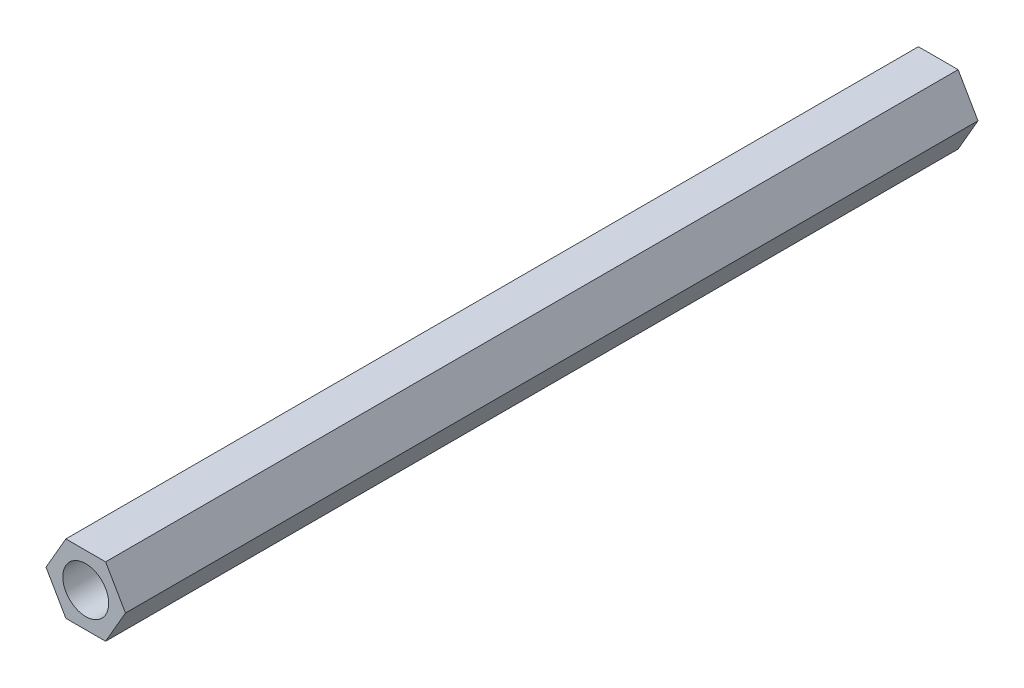
ISO-10303-21;
HEADER;
FILE_DESCRIPTION(('STEP AP214'),'2;1');
FILE_NAME('part.step','',(''),(''),'','','');
FILE_SCHEMA(('AUTOMOTIVE_DESIGN { 1 0 10303 214 1 1 1 1 }'));
ENDSEC;
DATA;
#1=APPLICATION_CONTEXT('core data for automotive mechanical design processes');
#2=APPLICATION_PROTOCOL_DEFINITION('international standard','automotive_design',2000,#1);
#3=PRODUCT_CONTEXT('',#1,'mechanical');
#4=PRODUCT('Part','Part','',(#3));
#5=PRODUCT_RELATED_PRODUCT_CATEGORY('part','',(#4));
#6=PRODUCT_DEFINITION_FORMATION('','',#4);
#7=PRODUCT_DEFINITION_CONTEXT('part definition',#1,'design');
#8=PRODUCT_DEFINITION('design','',#6,#7);
#9=PRODUCT_DEFINITION_SHAPE('','',#8);
#10=(LENGTH_UNIT() NAMED_UNIT(*) SI_UNIT(.MILLI.,.METRE.));
#11=(NAMED_UNIT(*) PLANE_ANGLE_UNIT() SI_UNIT($,.RADIAN.));
#12=(NAMED_UNIT(*) SI_UNIT($,.STERADIAN.) SOLID_ANGLE_UNIT());
#13=UNCERTAINTY_MEASURE_WITH_UNIT(LENGTH_MEASURE(1.E-05),#10,'distance_accuracy_value','');
#14=(GEOMETRIC_REPRESENTATION_CONTEXT(3) GLOBAL_UNCERTAINTY_ASSIGNED_CONTEXT((#13)) GLOBAL_UNIT_ASSIGNED_CONTEXT((#10,
#11,#12)) REPRESENTATION_CONTEXT('',''));
#15=CARTESIAN_POINT('',(0.,0.,0.));
#16=DIRECTION('',(0.,0.,1.));
#17=DIRECTION('',(1.,0.,0.));
#18=AXIS2_PLACEMENT_3D('',#15,#16,#17);
#19=CARTESIAN_POINT('',(0.,0.,111.5));
#20=DIRECTION('',(0.,0.,1.));
#21=DIRECTION('',(1.,0.,0.));
#22=AXIS2_PLACEMENT_3D('',#19,#20,#21);
#23=PLANE('',#22);
#24=DIRECTION('',(0.5,0.866025403784439,0.));
#25=VECTOR('',#24,1.);
#26=CARTESIAN_POINT('',(2.59807621135332,-4.5,111.5));
#27=LINE('',#26,#25);
#28=CARTESIAN_POINT('',(2.59807621135332,-4.5,111.5));
#29=VERTEX_POINT('',#28);
#30=CARTESIAN_POINT('',(5.19615242270663,0.,111.5));
#31=VERTEX_POINT('',#30);
#32=EDGE_CURVE('E131',#29,#31,#27,.T.);
#33=ORIENTED_EDGE('',*,*,#32,.T.);
#34=DIRECTION('',(-0.5,0.866025403784439,0.));
#35=VECTOR('',#34,1.);
#36=CARTESIAN_POINT('',(5.19615242270663,0.,111.5));
#37=LINE('',#36,#35);
#38=CARTESIAN_POINT('',(2.59807621135331,4.5,111.5));
#39=VERTEX_POINT('',#38);
#40=EDGE_CURVE('E89',#31,#39,#37,.T.);
#41=ORIENTED_EDGE('',*,*,#40,.T.);
#42=DIRECTION('',(-1.,0.,0.));
#43=VECTOR('',#42,1.);
#44=CARTESIAN_POINT('',(2.59807621135331,4.5,111.5));
#45=LINE('',#44,#43);
#46=CARTESIAN_POINT('',(-2.59807621135332,4.5,111.5));
#47=VERTEX_POINT('',#46);
#48=EDGE_CURVE('E102',#39,#47,#45,.T.);
#49=ORIENTED_EDGE('',*,*,#48,.T.);
#50=DIRECTION('',(-0.5,-0.866025403784439,0.));
#51=VECTOR('',#50,1.);
#52=CARTESIAN_POINT('',(-2.59807621135332,4.5,111.5));
#53=LINE('',#52,#51);
#54=CARTESIAN_POINT('',(-5.19615242270663,0.,111.5));
#55=VERTEX_POINT('',#54);
#56=EDGE_CURVE('E96',#47,#55,#53,.T.);
#57=ORIENTED_EDGE('',*,*,#56,.T.);
#58=DIRECTION('',(0.5,-0.866025403784439,0.));
#59=VECTOR('',#58,1.);
#60=CARTESIAN_POINT('',(-5.19615242270663,0.,111.5));
#61=LINE('',#60,#59);
#62=CARTESIAN_POINT('',(-2.59807621135332,-4.5,111.5));
#63=VERTEX_POINT('',#62);
#64=EDGE_CURVE('E100',#55,#63,#61,.T.);
#65=ORIENTED_EDGE('',*,*,#64,.T.);
#66=DIRECTION('',(1.,0.,0.));
#67=VECTOR('',#66,1.);
#68=CARTESIAN_POINT('',(-2.59807621135332,-4.5,111.5));
#69=LINE('',#68,#67);
#70=EDGE_CURVE('E52',#63,#29,#69,.T.);
#71=ORIENTED_EDGE('',*,*,#70,.T.);
#72=EDGE_LOOP('',(#33,#41,#49,#57,#65,#71));
#73=FACE_BOUND('',#72,.T.);
#74=CARTESIAN_POINT('',(0.,0.,111.5));
#75=DIRECTION('',(0.,0.,1.));
#76=DIRECTION('',(1.,0.,0.));
#77=AXIS2_PLACEMENT_3D('',#74,#75,#76);
#78=CIRCLE('',#77,3.);
#79=CARTESIAN_POINT('',(-3.,0.,111.5));
#80=VERTEX_POINT('',#79);
#81=EDGE_CURVE('E124',#80,#80,#78,.T.);
#82=ORIENTED_EDGE('',*,*,#81,.F.);
#83=EDGE_LOOP('',(#82));
#84=FACE_BOUND('',#83,.T.);
#85=ADVANCED_FACE('F35',(#73,#84),#23,.T.);
#86=CARTESIAN_POINT('',(0.,0.,0.));
#87=DIRECTION('',(0.,0.,1.));
#88=DIRECTION('',(1.,0.,0.));
#89=AXIS2_PLACEMENT_3D('',#86,#87,#88);
#90=PLANE('',#89);
#91=DIRECTION('',(0.5,0.866025403784439,0.));
#92=VECTOR('',#91,1.);
#93=CARTESIAN_POINT('',(2.59807621135332,-4.5,0.));
#94=LINE('',#93,#92);
#95=CARTESIAN_POINT('',(2.59807621135332,-4.5,0.));
#96=VERTEX_POINT('',#95);
#97=CARTESIAN_POINT('',(5.19615242270663,0.,0.));
#98=VERTEX_POINT('',#97);
#99=EDGE_CURVE('E120',#96,#98,#94,.T.);
#100=ORIENTED_EDGE('',*,*,#99,.F.);
#101=DIRECTION('',(1.,0.,0.));
#102=VECTOR('',#101,1.);
#103=CARTESIAN_POINT('',(-2.59807621135332,-4.5,0.));
#104=LINE('',#103,#102);
#105=CARTESIAN_POINT('',(-2.59807621135332,-4.5,0.));
#106=VERTEX_POINT('',#105);
#107=EDGE_CURVE('E81',#106,#96,#104,.T.);
#108=ORIENTED_EDGE('',*,*,#107,.F.);
#109=DIRECTION('',(0.5,-0.866025403784439,0.));
#110=VECTOR('',#109,1.);
#111=CARTESIAN_POINT('',(-5.19615242270663,0.,0.));
#112=LINE('',#111,#110);
#113=CARTESIAN_POINT('',(-5.19615242270663,0.,0.));
#114=VERTEX_POINT('',#113);
#115=EDGE_CURVE('E75',#114,#106,#112,.T.);
#116=ORIENTED_EDGE('',*,*,#115,.F.);
#117=DIRECTION('',(-0.5,-0.866025403784439,0.));
#118=VECTOR('',#117,1.);
#119=CARTESIAN_POINT('',(-2.59807621135332,4.5,0.));
#120=LINE('',#119,#118);
#121=CARTESIAN_POINT('',(-2.59807621135332,4.5,0.));
#122=VERTEX_POINT('',#121);
#123=EDGE_CURVE('E110',#122,#114,#120,.T.);
#124=ORIENTED_EDGE('',*,*,#123,.F.);
#125=DIRECTION('',(-1.,0.,0.));
#126=VECTOR('',#125,1.);
#127=CARTESIAN_POINT('',(2.59807621135331,4.5,0.));
#128=LINE('',#127,#126);
#129=CARTESIAN_POINT('',(2.59807621135331,4.5,0.));
#130=VERTEX_POINT('',#129);
#131=EDGE_CURVE('E126',#130,#122,#128,.T.);
#132=ORIENTED_EDGE('',*,*,#131,.F.);
#133=DIRECTION('',(-0.5,0.866025403784439,0.));
#134=VECTOR('',#133,1.);
#135=CARTESIAN_POINT('',(5.19615242270663,0.,0.));
#136=LINE('',#135,#134);
#137=EDGE_CURVE('E123',#98,#130,#136,.T.);
#138=ORIENTED_EDGE('',*,*,#137,.F.);
#139=EDGE_LOOP('',(#100,#108,#116,#124,#132,#138));
#140=FACE_BOUND('',#139,.T.);
#141=CARTESIAN_POINT('',(0.,0.,0.));
#142=DIRECTION('',(0.,0.,1.));
#143=DIRECTION('',(1.,0.,0.));
#144=AXIS2_PLACEMENT_3D('',#141,#142,#143);
#145=CIRCLE('',#144,3.);
#146=CARTESIAN_POINT('',(-3.,0.,0.));
#147=VERTEX_POINT('',#146);
#148=EDGE_CURVE('E224',#147,#147,#145,.T.);
#149=ORIENTED_EDGE('',*,*,#148,.T.);
#150=EDGE_LOOP('',(#149));
#151=FACE_BOUND('',#150,.T.);
#152=ADVANCED_FACE('F140',(#140,#151),#90,.F.);
#153=CARTESIAN_POINT('',(2.59807621135332,-4.5,111.5));
#154=DIRECTION('',(-0.866025403784439,0.5,0.));
#155=DIRECTION('',(-0.5,-0.866025403784439,0.));
#156=AXIS2_PLACEMENT_3D('',#153,#154,#155);
#157=PLANE('',#156);
#158=ORIENTED_EDGE('',*,*,#99,.T.);
#159=DIRECTION('',(0.,0.,-1.));
#160=VECTOR('',#159,1.);
#161=CARTESIAN_POINT('',(5.19615242270663,0.,111.5));
#162=LINE('',#161,#160);
#163=EDGE_CURVE('E11',#31,#98,#162,.T.);
#164=ORIENTED_EDGE('',*,*,#163,.F.);
#165=ORIENTED_EDGE('',*,*,#32,.F.);
#166=DIRECTION('',(0.,0.,-1.));
#167=VECTOR('',#166,1.);
#168=CARTESIAN_POINT('',(2.59807621135332,-4.5,111.5));
#169=LINE('',#168,#167);
#170=EDGE_CURVE('E116',#29,#96,#169,.T.);
#171=ORIENTED_EDGE('',*,*,#170,.T.);
#172=EDGE_LOOP('',(#158,#164,#165,#171));
#173=FACE_BOUND('',#172,.T.);
#174=ADVANCED_FACE('F37',(#173),#157,.F.);
#175=CARTESIAN_POINT('',(5.19615242270663,0.,111.5));
#176=DIRECTION('',(-0.866025403784439,-0.5,0.));
#177=DIRECTION('',(0.5,-0.866025403784439,0.));
#178=AXIS2_PLACEMENT_3D('',#175,#176,#177);
#179=PLANE('',#178);
#180=ORIENTED_EDGE('',*,*,#137,.T.);
#181=DIRECTION('',(0.,0.,-1.));
#182=VECTOR('',#181,1.);
#183=CARTESIAN_POINT('',(2.59807621135331,4.5,111.5));
#184=LINE('',#183,#182);
#185=EDGE_CURVE('E44',#39,#130,#184,.T.);
#186=ORIENTED_EDGE('',*,*,#185,.F.);
#187=ORIENTED_EDGE('',*,*,#40,.F.);
#188=ORIENTED_EDGE('',*,*,#163,.T.);
#189=EDGE_LOOP('',(#180,#186,#187,#188));
#190=FACE_BOUND('',#189,.T.);
#191=ADVANCED_FACE('F165',(#190),#179,.F.);
#192=CARTESIAN_POINT('',(2.59807621135331,4.5,111.5));
#193=DIRECTION('',(0.,-1.,0.));
#194=DIRECTION('',(0.,0.,-1.));
#195=AXIS2_PLACEMENT_3D('',#192,#193,#194);
#196=PLANE('',#195);
#197=ORIENTED_EDGE('',*,*,#131,.T.);
#198=DIRECTION('',(0.,0.,-1.));
#199=VECTOR('',#198,1.);
#200=CARTESIAN_POINT('',(-2.59807621135332,4.5,111.5));
#201=LINE('',#200,#199);
#202=EDGE_CURVE('E111',#47,#122,#201,.T.);
#203=ORIENTED_EDGE('',*,*,#202,.F.);
#204=ORIENTED_EDGE('',*,*,#48,.F.);
#205=ORIENTED_EDGE('',*,*,#185,.T.);
#206=EDGE_LOOP('',(#197,#203,#204,#205));
#207=FACE_BOUND('',#206,.T.);
#208=ADVANCED_FACE('F137',(#207),#196,.F.);
#209=CARTESIAN_POINT('',(-2.59807621135332,4.5,111.5));
#210=DIRECTION('',(0.866025403784438,-0.5,0.));
#211=DIRECTION('',(0.5,0.866025403784439,0.));
#212=AXIS2_PLACEMENT_3D('',#209,#210,#211);
#213=PLANE('',#212);
#214=ORIENTED_EDGE('',*,*,#123,.T.);
#215=DIRECTION('',(0.,0.,-1.));
#216=VECTOR('',#215,1.);
#217=CARTESIAN_POINT('',(-5.19615242270663,0.,111.5));
#218=LINE('',#217,#216);
#219=EDGE_CURVE('E107',#55,#114,#218,.T.);
#220=ORIENTED_EDGE('',*,*,#219,.F.);
#221=ORIENTED_EDGE('',*,*,#56,.F.);
#222=ORIENTED_EDGE('',*,*,#202,.T.);
#223=EDGE_LOOP('',(#214,#220,#221,#222));
#224=FACE_BOUND('',#223,.T.);
#225=ADVANCED_FACE('F108',(#224),#213,.F.);
#226=CARTESIAN_POINT('',(-5.19615242270663,0.,111.5));
#227=DIRECTION('',(0.866025403784438,0.5,0.));
#228=DIRECTION('',(-0.5,0.866025403784439,0.));
#229=AXIS2_PLACEMENT_3D('',#226,#227,#228);
#230=PLANE('',#229);
#231=ORIENTED_EDGE('',*,*,#115,.T.);
#232=DIRECTION('',(0.,0.,-1.));
#233=VECTOR('',#232,1.);
#234=CARTESIAN_POINT('',(-2.59807621135332,-4.5,111.5));
#235=LINE('',#234,#233);
#236=EDGE_CURVE('E112',#63,#106,#235,.T.);
#237=ORIENTED_EDGE('',*,*,#236,.F.);
#238=ORIENTED_EDGE('',*,*,#64,.F.);
#239=ORIENTED_EDGE('',*,*,#219,.T.);
#240=EDGE_LOOP('',(#231,#237,#238,#239));
#241=FACE_BOUND('',#240,.T.);
#242=ADVANCED_FACE('F114',(#241),#230,.F.);
#243=CARTESIAN_POINT('',(-2.59807621135332,-4.5,111.5));
#244=DIRECTION('',(0.,1.,0.));
#245=DIRECTION('',(-1.,0.,0.));
#246=AXIS2_PLACEMENT_3D('',#243,#244,#245);
#247=PLANE('',#246);
#248=ORIENTED_EDGE('',*,*,#107,.T.);
#249=ORIENTED_EDGE('',*,*,#170,.F.);
#250=ORIENTED_EDGE('',*,*,#70,.F.);
#251=ORIENTED_EDGE('',*,*,#236,.T.);
#252=EDGE_LOOP('',(#248,#249,#250,#251));
#253=FACE_BOUND('',#252,.T.);
#254=ADVANCED_FACE('F145',(#253),#247,.F.);
#255=CARTESIAN_POINT('',(0.,0.,111.5));
#256=DIRECTION('',(0.,0.,-1.));
#257=DIRECTION('',(-1.,0.,0.));
#258=AXIS2_PLACEMENT_3D('',#255,#256,#257);
#259=CYLINDRICAL_SURFACE('',#258,3.);
#260=CARTESIAN_POINT('',(-3.,0.,111.5));
#261=CARTESIAN_POINT('',(-3.,0.,110.338541666667));
#262=CARTESIAN_POINT('',(-3.,0.,109.177083333333));
#263=CARTESIAN_POINT('',(-3.,0.,106.854166666667));
#264=CARTESIAN_POINT('',(-3.,0.,105.692708333333));
#265=CARTESIAN_POINT('',(-3.,0.,103.369791666667));
#266=CARTESIAN_POINT('',(-3.,0.,102.208333333333));
#267=CARTESIAN_POINT('',(-3.,0.,99.8854166666667));
#268=CARTESIAN_POINT('',(-3.,0.,98.7239583333333));
#269=CARTESIAN_POINT('',(-3.,0.,96.4010416666667));
#270=CARTESIAN_POINT('',(-3.,0.,95.2395833333333));
#271=CARTESIAN_POINT('',(-3.,0.,92.9166666666667));
#272=CARTESIAN_POINT('',(-3.,0.,91.7552083333333));
#273=CARTESIAN_POINT('',(-3.,0.,89.4322916666667));
#274=CARTESIAN_POINT('',(-3.,0.,88.2708333333333));
#275=CARTESIAN_POINT('',(-3.,0.,85.9479166666667));
#276=CARTESIAN_POINT('',(-3.,0.,84.7864583333333));
#277=CARTESIAN_POINT('',(-3.,0.,82.4635416666667));
#278=CARTESIAN_POINT('',(-3.,0.,81.3020833333333));
#279=CARTESIAN_POINT('',(-3.,0.,78.9791666666667));
#280=CARTESIAN_POINT('',(-3.,0.,77.8177083333333));
#281=CARTESIAN_POINT('',(-3.,0.,75.4947916666667));
#282=CARTESIAN_POINT('',(-3.,0.,74.3333333333333));
#283=CARTESIAN_POINT('',(-3.,0.,72.0104166666667));
#284=CARTESIAN_POINT('',(-3.,0.,70.8489583333333));
#285=CARTESIAN_POINT('',(-3.,0.,68.5260416666667));
#286=CARTESIAN_POINT('',(-3.,0.,67.3645833333333));
#287=CARTESIAN_POINT('',(-3.,0.,65.0416666666667));
#288=CARTESIAN_POINT('',(-3.,0.,63.8802083333333));
#289=CARTESIAN_POINT('',(-3.,0.,61.5572916666667));
#290=CARTESIAN_POINT('',(-3.,0.,60.3958333333333));
#291=CARTESIAN_POINT('',(-3.,0.,58.0729166666667));
#292=CARTESIAN_POINT('',(-3.,0.,56.9114583333333));
#293=CARTESIAN_POINT('',(-3.,0.,54.5885416666667));
#294=CARTESIAN_POINT('',(-3.,0.,53.4270833333333));
#295=CARTESIAN_POINT('',(-3.,0.,51.1041666666667));
#296=CARTESIAN_POINT('',(-3.,0.,49.9427083333333));
#297=CARTESIAN_POINT('',(-3.,0.,47.6197916666667));
#298=CARTESIAN_POINT('',(-3.,0.,46.4583333333333));
#299=CARTESIAN_POINT('',(-3.,0.,44.1354166666667));
#300=CARTESIAN_POINT('',(-3.,0.,42.9739583333333));
#301=CARTESIAN_POINT('',(-3.,0.,40.6510416666667));
#302=CARTESIAN_POINT('',(-3.,0.,39.4895833333333));
#303=CARTESIAN_POINT('',(-3.,0.,37.1666666666667));
#304=CARTESIAN_POINT('',(-3.,0.,36.0052083333333));
#305=CARTESIAN_POINT('',(-3.,0.,33.6822916666667));
#306=CARTESIAN_POINT('',(-3.,0.,32.5208333333333));
#307=CARTESIAN_POINT('',(-3.,0.,30.1979166666667));
#308=CARTESIAN_POINT('',(-3.,0.,29.0364583333333));
#309=CARTESIAN_POINT('',(-3.,0.,26.7135416666667));
#310=CARTESIAN_POINT('',(-3.,0.,25.5520833333333));
#311=CARTESIAN_POINT('',(-3.,0.,23.2291666666667));
#312=CARTESIAN_POINT('',(-3.,0.,22.0677083333333));
#313=CARTESIAN_POINT('',(-3.,0.,19.7447916666667));
#314=CARTESIAN_POINT('',(-3.,0.,18.5833333333333));
#315=CARTESIAN_POINT('',(-3.,0.,16.2604166666667));
#316=CARTESIAN_POINT('',(-3.,0.,15.0989583333333));
#317=CARTESIAN_POINT('',(-3.,0.,12.7760416666667));
#318=CARTESIAN_POINT('',(-3.,0.,11.6145833333333));
#319=CARTESIAN_POINT('',(-3.,0.,9.29166666666666));
#320=CARTESIAN_POINT('',(-3.,0.,8.13020833333333));
#321=CARTESIAN_POINT('',(-3.,0.,5.80729166666666));
#322=CARTESIAN_POINT('',(-3.,0.,4.64583333333333));
#323=CARTESIAN_POINT('',(-3.,0.,2.32291666666667));
#324=CARTESIAN_POINT('',(-3.,0.,1.16145833333333));
#325=CARTESIAN_POINT('',(-3.,0.,0.));
#326=B_SPLINE_CURVE_WITH_KNOTS('',3,(#260,#261,#262,#263,#264,#265,#266,#267,#268,#269,#270,
#271,#272,#273,#274,#275,#276,#277,#278,#279,#280,#281,#282,#283,#284,#285,#286,#287,#288,#289,
#290,#291,#292,#293,#294,#295,#296,#297,#298,#299,#300,#301,#302,#303,#304,#305,#306,#307,#308,
#309,#310,#311,#312,#313,#314,#315,#316,#317,#318,#319,#320,#321,#322,#323,#324,#325),
.UNSPECIFIED.,.F.,.F.,(4,2,2,2,2,2,2,2,2,2,2,2,2,2,2,2,2,2,2,2,2,2,2,2,2,2,2,2,2,2,2,2,4),(0.,
3.484375,6.96875,10.453125,13.9375,17.421875,20.90625,24.390625,27.875,31.359375,34.84375,
38.328125,41.8125,45.296875,48.78125,52.265625,55.75,59.234375,62.71875,66.203125,69.6875,
73.171875,76.65625,80.140625,83.625,87.109375,90.59375,94.078125,97.5625,101.046875,104.53125,
108.015625,111.5),.UNSPECIFIED.);
#327=EDGE_CURVE('BSEAM147',#80,#147,#326,.T.);
#328=ORIENTED_EDGE('',*,*,#81,.T.);
#329=ORIENTED_EDGE('',*,*,#148,.F.);
#330=ORIENTED_EDGE('',*,*,#327,.T.);
#331=ORIENTED_EDGE('',*,*,#327,.F.);
#332=EDGE_LOOP('',(#328,#330,#329,#331));
#333=FACE_BOUND('',#332,.T.);
#334=ADVANCED_FACE('F147',(#333),#259,.F.);
#335=CLOSED_SHELL('',(#85,#152,#174,#191,#208,#225,#242,#254,#334));
#336=MANIFOLD_SOLID_BREP('B2',#335);
#337=ADVANCED_BREP_SHAPE_REPRESENTATION('',(#18,#336),#14);
#338=SHAPE_DEFINITION_REPRESENTATION(#9,#337);
ENDSEC;
END-ISO-10303-21;
